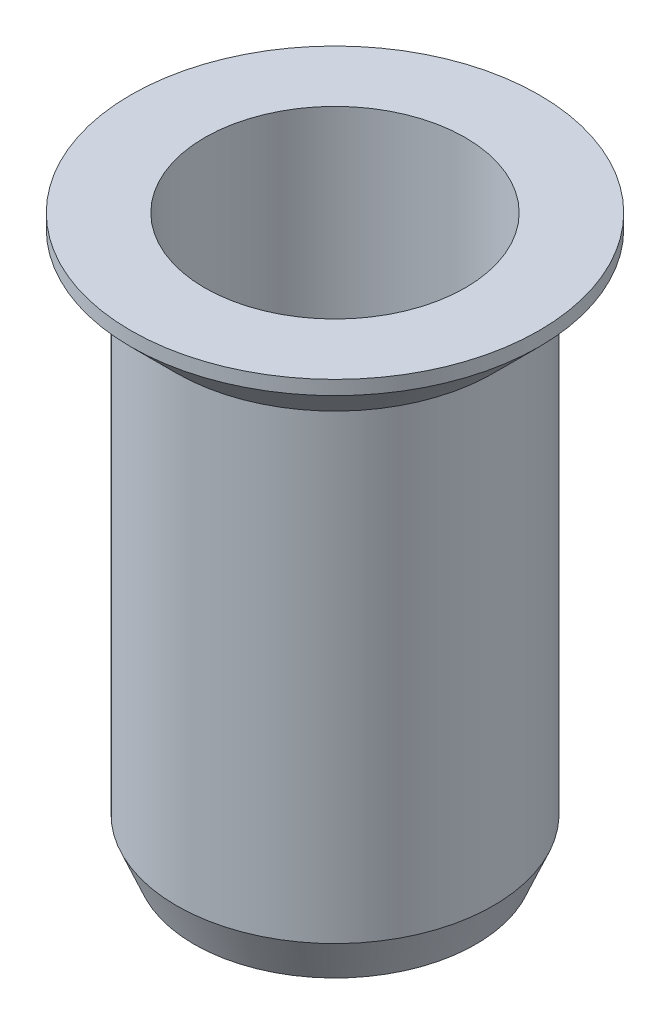
ISO-10303-21;
HEADER;
FILE_DESCRIPTION(('STEP AP214'),'2;1');
FILE_NAME('part.step','',(''),(''),'','','');
FILE_SCHEMA(('AUTOMOTIVE_DESIGN { 1 0 10303 214 1 1 1 1 }'));
ENDSEC;
DATA;
#1=APPLICATION_CONTEXT('core data for automotive mechanical design processes');
#2=APPLICATION_PROTOCOL_DEFINITION('international standard','automotive_design',2000,#1);
#3=PRODUCT_CONTEXT('',#1,'mechanical');
#4=PRODUCT('Part','Part','',(#3));
#5=PRODUCT_RELATED_PRODUCT_CATEGORY('part','',(#4));
#6=PRODUCT_DEFINITION_FORMATION('','',#4);
#7=PRODUCT_DEFINITION_CONTEXT('part definition',#1,'design');
#8=PRODUCT_DEFINITION('design','',#6,#7);
#9=PRODUCT_DEFINITION_SHAPE('','',#8);
#10=(LENGTH_UNIT() NAMED_UNIT(*) SI_UNIT(.MILLI.,.METRE.));
#11=(NAMED_UNIT(*) PLANE_ANGLE_UNIT() SI_UNIT($,.RADIAN.));
#12=(NAMED_UNIT(*) SI_UNIT($,.STERADIAN.) SOLID_ANGLE_UNIT());
#13=UNCERTAINTY_MEASURE_WITH_UNIT(LENGTH_MEASURE(1.E-05),#10,'distance_accuracy_value','');
#14=(GEOMETRIC_REPRESENTATION_CONTEXT(3) GLOBAL_UNCERTAINTY_ASSIGNED_CONTEXT((#13)) GLOBAL_UNIT_ASSIGNED_CONTEXT((#10,
#11,#12)) REPRESENTATION_CONTEXT('',''));
#15=CARTESIAN_POINT('',(0.,0.,0.));
#16=DIRECTION('',(0.,0.,1.));
#17=DIRECTION('',(1.,0.,0.));
#18=AXIS2_PLACEMENT_3D('',#15,#16,#17);
#19=CARTESIAN_POINT('',(0.,0.,0.));
#20=DIRECTION('',(0.,-1.,0.));
#21=DIRECTION('',(0.,0.,-1.));
#22=AXIS2_PLACEMENT_3D('',#19,#20,#21);
#23=CYLINDRICAL_SURFACE('',#22,3.);
#24=CARTESIAN_POINT('',(0.,0.,0.));
#25=DIRECTION('',(0.,-1.,0.));
#26=DIRECTION('',(0.,0.,-1.));
#27=AXIS2_PLACEMENT_3D('',#24,#25,#26);
#28=CIRCLE('',#27,3.);
#29=CARTESIAN_POINT('',(0.,0.,-3.));
#30=VERTEX_POINT('',#29);
#31=EDGE_CURVE('E10',#30,#30,#28,.T.);
#32=ORIENTED_EDGE('',*,*,#31,.T.);
#33=EDGE_LOOP('',(#32));
#34=FACE_BOUND('',#33,.T.);
#35=CARTESIAN_POINT('',(0.,9.,0.));
#36=DIRECTION('',(0.,-1.,0.));
#37=DIRECTION('',(0.,0.,-1.));
#38=AXIS2_PLACEMENT_3D('',#35,#36,#37);
#39=CIRCLE('',#38,3.);
#40=CARTESIAN_POINT('',(0.,9.,-3.));
#41=VERTEX_POINT('',#40);
#42=EDGE_CURVE('E62',#41,#41,#39,.T.);
#43=ORIENTED_EDGE('',*,*,#42,.F.);
#44=EDGE_LOOP('',(#43));
#45=FACE_BOUND('',#44,.T.);
#46=ADVANCED_FACE('F31',(#34,#45),#23,.F.);
#47=CARTESIAN_POINT('',(4.,0.,0.));
#48=DIRECTION('',(0.,-1.,0.));
#49=DIRECTION('',(0.,0.,-1.));
#50=AXIS2_PLACEMENT_3D('',#47,#48,#49);
#51=PLANE('',#50);
#52=CARTESIAN_POINT('',(0.,0.,0.));
#53=DIRECTION('',(0.,-1.,0.));
#54=DIRECTION('',(0.,0.,-1.));
#55=AXIS2_PLACEMENT_3D('',#52,#53,#54);
#56=CIRCLE('',#55,4.);
#57=CARTESIAN_POINT('',(0.,0.,-4.));
#58=VERTEX_POINT('',#57);
#59=EDGE_CURVE('E37',#58,#58,#56,.T.);
#60=ORIENTED_EDGE('',*,*,#59,.T.);
#61=EDGE_LOOP('',(#60));
#62=FACE_BOUND('',#61,.T.);
#63=ORIENTED_EDGE('',*,*,#31,.F.);
#64=EDGE_LOOP('',(#63));
#65=FACE_BOUND('',#64,.T.);
#66=ADVANCED_FACE('F70',(#62,#65),#51,.T.);
#67=CARTESIAN_POINT('',(0.,0.,0.));
#68=DIRECTION('',(0.,1.,0.));
#69=DIRECTION('',(0.,0.,1.));
#70=AXIS2_PLACEMENT_3D('',#67,#68,#69);
#71=CONICAL_SURFACE('',#70,4.,0.394791119699762);
#72=CARTESIAN_POINT('',(0.,1.2,0.));
#73=DIRECTION('',(0.,-1.,0.));
#74=DIRECTION('',(0.,0.,-1.));
#75=AXIS2_PLACEMENT_3D('',#72,#73,#74);
#76=CIRCLE('',#75,4.5);
#77=CARTESIAN_POINT('',(0.,1.2,-4.5));
#78=VERTEX_POINT('',#77);
#79=EDGE_CURVE('E41',#78,#78,#76,.T.);
#80=ORIENTED_EDGE('',*,*,#79,.T.);
#81=EDGE_LOOP('',(#80));
#82=FACE_BOUND('',#81,.T.);
#83=ORIENTED_EDGE('',*,*,#59,.F.);
#84=EDGE_LOOP('',(#83));
#85=FACE_BOUND('',#84,.T.);
#86=ADVANCED_FACE('F74',(#82,#85),#71,.T.);
#87=CARTESIAN_POINT('',(0.,0.,0.));
#88=DIRECTION('',(0.,-1.,0.));
#89=DIRECTION('',(0.,0.,-1.));
#90=AXIS2_PLACEMENT_3D('',#87,#88,#89);
#91=CYLINDRICAL_SURFACE('',#90,4.5);
#92=CARTESIAN_POINT('',(0.,14.3,0.));
#93=DIRECTION('',(0.,-1.,0.));
#94=DIRECTION('',(0.,0.,-1.));
#95=AXIS2_PLACEMENT_3D('',#92,#93,#94);
#96=CIRCLE('',#95,4.5);
#97=CARTESIAN_POINT('',(0.,14.3,-4.5));
#98=VERTEX_POINT('',#97);
#99=EDGE_CURVE('E45',#98,#98,#96,.T.);
#100=ORIENTED_EDGE('',*,*,#99,.T.);
#101=EDGE_LOOP('',(#100));
#102=FACE_BOUND('',#101,.T.);
#103=ORIENTED_EDGE('',*,*,#79,.F.);
#104=EDGE_LOOP('',(#103));
#105=FACE_BOUND('',#104,.T.);
#106=ADVANCED_FACE('F78',(#102,#105),#91,.T.);
#107=CARTESIAN_POINT('',(0.,14.3,0.));
#108=DIRECTION('',(0.,1.,0.));
#109=DIRECTION('',(0.,0.,1.));
#110=AXIS2_PLACEMENT_3D('',#107,#108,#109);
#111=CONICAL_SURFACE('',#110,4.5,0.785398163397449);
#112=CARTESIAN_POINT('',(0.,15.6,0.));
#113=DIRECTION('',(0.,-1.,0.));
#114=DIRECTION('',(0.,0.,-1.));
#115=AXIS2_PLACEMENT_3D('',#112,#113,#114);
#116=CIRCLE('',#115,5.8);
#117=CARTESIAN_POINT('',(0.,15.6,-5.8));
#118=VERTEX_POINT('',#117);
#119=EDGE_CURVE('E50',#118,#118,#116,.T.);
#120=ORIENTED_EDGE('',*,*,#119,.T.);
#121=EDGE_LOOP('',(#120));
#122=FACE_BOUND('',#121,.T.);
#123=ORIENTED_EDGE('',*,*,#99,.F.);
#124=EDGE_LOOP('',(#123));
#125=FACE_BOUND('',#124,.T.);
#126=ADVANCED_FACE('F85',(#122,#125),#111,.T.);
#127=CARTESIAN_POINT('',(0.,0.,0.));
#128=DIRECTION('',(0.,-1.,0.));
#129=DIRECTION('',(0.,0.,-1.));
#130=AXIS2_PLACEMENT_3D('',#127,#128,#129);
#131=CYLINDRICAL_SURFACE('',#130,5.8);
#132=CARTESIAN_POINT('',(0.,16.,0.));
#133=DIRECTION('',(0.,-1.,0.));
#134=DIRECTION('',(0.,0.,-1.));
#135=AXIS2_PLACEMENT_3D('',#132,#133,#134);
#136=CIRCLE('',#135,5.8);
#137=CARTESIAN_POINT('',(0.,16.,-5.8));
#138=VERTEX_POINT('',#137);
#139=EDGE_CURVE('E53',#138,#138,#136,.T.);
#140=ORIENTED_EDGE('',*,*,#139,.T.);
#141=EDGE_LOOP('',(#140));
#142=FACE_BOUND('',#141,.T.);
#143=ORIENTED_EDGE('',*,*,#119,.F.);
#144=EDGE_LOOP('',(#143));
#145=FACE_BOUND('',#144,.T.);
#146=ADVANCED_FACE('F89',(#142,#145),#131,.T.);
#147=CARTESIAN_POINT('',(3.7,16.,0.));
#148=DIRECTION('',(0.,1.,0.));
#149=DIRECTION('',(0.,0.,1.));
#150=AXIS2_PLACEMENT_3D('',#147,#148,#149);
#151=PLANE('',#150);
#152=CARTESIAN_POINT('',(0.,16.,0.));
#153=DIRECTION('',(0.,-1.,0.));
#154=DIRECTION('',(0.,0.,-1.));
#155=AXIS2_PLACEMENT_3D('',#152,#153,#154);
#156=CIRCLE('',#155,3.7);
#157=CARTESIAN_POINT('',(0.,16.,-3.7));
#158=VERTEX_POINT('',#157);
#159=EDGE_CURVE('E56',#158,#158,#156,.T.);
#160=ORIENTED_EDGE('',*,*,#159,.T.);
#161=EDGE_LOOP('',(#160));
#162=FACE_BOUND('',#161,.T.);
#163=ORIENTED_EDGE('',*,*,#139,.F.);
#164=EDGE_LOOP('',(#163));
#165=FACE_BOUND('',#164,.T.);
#166=ADVANCED_FACE('F93',(#162,#165),#151,.T.);
#167=CARTESIAN_POINT('',(0.,0.,0.));
#168=DIRECTION('',(0.,-1.,0.));
#169=DIRECTION('',(0.,0.,-1.));
#170=AXIS2_PLACEMENT_3D('',#167,#168,#169);
#171=CYLINDRICAL_SURFACE('',#170,3.7);
#172=CARTESIAN_POINT('',(0.,9.,0.));
#173=DIRECTION('',(0.,-1.,0.));
#174=DIRECTION('',(0.,0.,-1.));
#175=AXIS2_PLACEMENT_3D('',#172,#173,#174);
#176=CIRCLE('',#175,3.7);
#177=CARTESIAN_POINT('',(0.,9.,-3.7));
#178=VERTEX_POINT('',#177);
#179=EDGE_CURVE('E59',#178,#178,#176,.T.);
#180=ORIENTED_EDGE('',*,*,#179,.T.);
#181=EDGE_LOOP('',(#180));
#182=FACE_BOUND('',#181,.T.);
#183=ORIENTED_EDGE('',*,*,#159,.F.);
#184=EDGE_LOOP('',(#183));
#185=FACE_BOUND('',#184,.T.);
#186=ADVANCED_FACE('F97',(#182,#185),#171,.F.);
#187=CARTESIAN_POINT('',(3.7,9.,0.));
#188=DIRECTION('',(0.,1.,0.));
#189=DIRECTION('',(0.,0.,1.));
#190=AXIS2_PLACEMENT_3D('',#187,#188,#189);
#191=PLANE('',#190);
#192=ORIENTED_EDGE('',*,*,#42,.T.);
#193=EDGE_LOOP('',(#192));
#194=FACE_BOUND('',#193,.T.);
#195=ORIENTED_EDGE('',*,*,#179,.F.);
#196=EDGE_LOOP('',(#195));
#197=FACE_BOUND('',#196,.T.);
#198=ADVANCED_FACE('F66',(#194,#197),#191,.T.);
#199=CLOSED_SHELL('',(#46,#66,#86,#106,#126,#146,#166,#186,#198));
#200=MANIFOLD_SOLID_BREP('B2',#199);
#201=ADVANCED_BREP_SHAPE_REPRESENTATION('',(#18,#200),#14);
#202=SHAPE_DEFINITION_REPRESENTATION(#9,#201);
ENDSEC;
END-ISO-10303-21;
